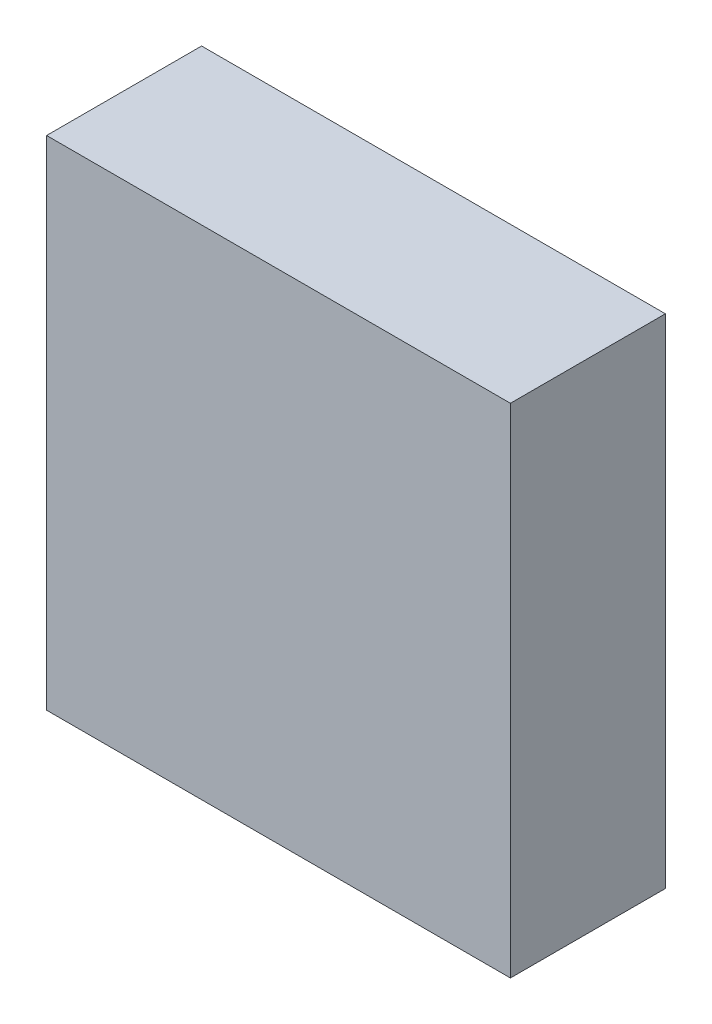
ISO-10303-21;
HEADER;
FILE_DESCRIPTION(('STEP AP214'),'2;1');
FILE_NAME('part.step','',(''),(''),'','','');
FILE_SCHEMA(('AUTOMOTIVE_DESIGN { 1 0 10303 214 1 1 1 1 }'));
ENDSEC;
DATA;
#1=APPLICATION_CONTEXT('core data for automotive mechanical design processes');
#2=APPLICATION_PROTOCOL_DEFINITION('international standard','automotive_design',2000,#1);
#3=PRODUCT_CONTEXT('',#1,'mechanical');
#4=PRODUCT('Part','Part','',(#3));
#5=PRODUCT_RELATED_PRODUCT_CATEGORY('part','',(#4));
#6=PRODUCT_DEFINITION_FORMATION('','',#4);
#7=PRODUCT_DEFINITION_CONTEXT('part definition',#1,'design');
#8=PRODUCT_DEFINITION('design','',#6,#7);
#9=PRODUCT_DEFINITION_SHAPE('','',#8);
#10=(LENGTH_UNIT() NAMED_UNIT(*) SI_UNIT(.MILLI.,.METRE.));
#11=(NAMED_UNIT(*) PLANE_ANGLE_UNIT() SI_UNIT($,.RADIAN.));
#12=(NAMED_UNIT(*) SI_UNIT($,.STERADIAN.) SOLID_ANGLE_UNIT());
#13=UNCERTAINTY_MEASURE_WITH_UNIT(LENGTH_MEASURE(1.E-05),#10,'distance_accuracy_value','');
#14=(GEOMETRIC_REPRESENTATION_CONTEXT(3) GLOBAL_UNCERTAINTY_ASSIGNED_CONTEXT((#13)) GLOBAL_UNIT_ASSIGNED_CONTEXT((#10,
#11,#12)) REPRESENTATION_CONTEXT('',''));
#15=CARTESIAN_POINT('',(0.,0.,0.));
#16=DIRECTION('',(0.,0.,1.));
#17=DIRECTION('',(1.,0.,0.));
#18=AXIS2_PLACEMENT_3D('',#15,#16,#17);
#19=CARTESIAN_POINT('',(102.5,110.,68.5));
#20=DIRECTION('',(-1.,0.,0.));
#21=DIRECTION('',(0.,-1.,0.));
#22=AXIS2_PLACEMENT_3D('',#19,#20,#21);
#23=PLANE('',#22);
#24=DIRECTION('',(0.,1.,0.));
#25=VECTOR('',#24,1.);
#26=CARTESIAN_POINT('',(102.5,110.,0.));
#27=LINE('',#26,#25);
#28=CARTESIAN_POINT('',(102.5,-110.,0.));
#29=VERTEX_POINT('',#28);
#30=CARTESIAN_POINT('',(102.5,110.,0.));
#31=VERTEX_POINT('',#30);
#32=EDGE_CURVE('E96',#29,#31,#27,.T.);
#33=ORIENTED_EDGE('',*,*,#32,.T.);
#34=DIRECTION('',(0.,0.,-1.));
#35=VECTOR('',#34,1.);
#36=CARTESIAN_POINT('',(102.5,110.,68.5));
#37=LINE('',#36,#35);
#38=CARTESIAN_POINT('',(102.5,110.,68.5));
#39=VERTEX_POINT('',#38);
#40=EDGE_CURVE('E11',#39,#31,#37,.T.);
#41=ORIENTED_EDGE('',*,*,#40,.F.);
#42=DIRECTION('',(0.,1.,0.));
#43=VECTOR('',#42,1.);
#44=CARTESIAN_POINT('',(102.5,110.,68.5));
#45=LINE('',#44,#43);
#46=CARTESIAN_POINT('',(102.5,-110.,68.5));
#47=VERTEX_POINT('',#46);
#48=EDGE_CURVE('E84',#47,#39,#45,.T.);
#49=ORIENTED_EDGE('',*,*,#48,.F.);
#50=DIRECTION('',(0.,0.,-1.));
#51=VECTOR('',#50,1.);
#52=CARTESIAN_POINT('',(102.5,-110.,68.5));
#53=LINE('',#52,#51);
#54=EDGE_CURVE('E92',#47,#29,#53,.T.);
#55=ORIENTED_EDGE('',*,*,#54,.T.);
#56=EDGE_LOOP('',(#33,#41,#49,#55));
#57=FACE_BOUND('',#56,.T.);
#58=ADVANCED_FACE('F33',(#57),#23,.F.);
#59=CARTESIAN_POINT('',(-102.5,110.,68.5));
#60=DIRECTION('',(0.,-1.,0.));
#61=DIRECTION('',(0.,0.,-1.));
#62=AXIS2_PLACEMENT_3D('',#59,#60,#61);
#63=PLANE('',#62);
#64=DIRECTION('',(-1.,0.,0.));
#65=VECTOR('',#64,1.);
#66=CARTESIAN_POINT('',(-102.5,110.,0.));
#67=LINE('',#66,#65);
#68=CARTESIAN_POINT('',(-102.5,110.,0.));
#69=VERTEX_POINT('',#68);
#70=EDGE_CURVE('E88',#31,#69,#67,.T.);
#71=ORIENTED_EDGE('',*,*,#70,.T.);
#72=DIRECTION('',(0.,0.,-1.));
#73=VECTOR('',#72,1.);
#74=CARTESIAN_POINT('',(-102.5,110.,68.5));
#75=LINE('',#74,#73);
#76=CARTESIAN_POINT('',(-102.5,110.,68.5));
#77=VERTEX_POINT('',#76);
#78=EDGE_CURVE('E41',#77,#69,#75,.T.);
#79=ORIENTED_EDGE('',*,*,#78,.F.);
#80=DIRECTION('',(-1.,0.,0.));
#81=VECTOR('',#80,1.);
#82=CARTESIAN_POINT('',(-102.5,110.,68.5));
#83=LINE('',#82,#81);
#84=EDGE_CURVE('E79',#39,#77,#83,.T.);
#85=ORIENTED_EDGE('',*,*,#84,.F.);
#86=ORIENTED_EDGE('',*,*,#40,.T.);
#87=EDGE_LOOP('',(#71,#79,#85,#86));
#88=FACE_BOUND('',#87,.T.);
#89=ADVANCED_FACE('F87',(#88),#63,.F.);
#90=CARTESIAN_POINT('',(-102.5,110.,68.5));
#91=DIRECTION('',(1.,0.,0.));
#92=DIRECTION('',(0.,1.,0.));
#93=AXIS2_PLACEMENT_3D('',#90,#91,#92);
#94=PLANE('',#93);
#95=DIRECTION('',(0.,-1.,0.));
#96=VECTOR('',#95,1.);
#97=CARTESIAN_POINT('',(-102.5,110.,0.));
#98=LINE('',#97,#96);
#99=CARTESIAN_POINT('',(-102.5,-110.,0.));
#100=VERTEX_POINT('',#99);
#101=EDGE_CURVE('E66',#69,#100,#98,.T.);
#102=ORIENTED_EDGE('',*,*,#101,.T.);
#103=DIRECTION('',(0.,0.,-1.));
#104=VECTOR('',#103,1.);
#105=CARTESIAN_POINT('',(-102.5,-110.,68.5));
#106=LINE('',#105,#104);
#107=CARTESIAN_POINT('',(-102.5,-110.,68.5));
#108=VERTEX_POINT('',#107);
#109=EDGE_CURVE('E89',#108,#100,#106,.T.);
#110=ORIENTED_EDGE('',*,*,#109,.F.);
#111=DIRECTION('',(0.,-1.,0.));
#112=VECTOR('',#111,1.);
#113=CARTESIAN_POINT('',(-102.5,110.,68.5));
#114=LINE('',#113,#112);
#115=EDGE_CURVE('E82',#77,#108,#114,.T.);
#116=ORIENTED_EDGE('',*,*,#115,.F.);
#117=ORIENTED_EDGE('',*,*,#78,.T.);
#118=EDGE_LOOP('',(#102,#110,#116,#117));
#119=FACE_BOUND('',#118,.T.);
#120=ADVANCED_FACE('F90',(#119),#94,.F.);
#121=CARTESIAN_POINT('',(-102.5,-110.,68.5));
#122=DIRECTION('',(0.,1.,0.));
#123=DIRECTION('',(-1.,0.,0.));
#124=AXIS2_PLACEMENT_3D('',#121,#122,#123);
#125=PLANE('',#124);
#126=DIRECTION('',(1.,0.,0.));
#127=VECTOR('',#126,1.);
#128=CARTESIAN_POINT('',(-102.5,-110.,0.));
#129=LINE('',#128,#127);
#130=EDGE_CURVE('E72',#100,#29,#129,.T.);
#131=ORIENTED_EDGE('',*,*,#130,.T.);
#132=ORIENTED_EDGE('',*,*,#54,.F.);
#133=DIRECTION('',(1.,0.,0.));
#134=VECTOR('',#133,1.);
#135=CARTESIAN_POINT('',(-102.5,-110.,68.5));
#136=LINE('',#135,#134);
#137=EDGE_CURVE('E49',#108,#47,#136,.T.);
#138=ORIENTED_EDGE('',*,*,#137,.F.);
#139=ORIENTED_EDGE('',*,*,#109,.T.);
#140=EDGE_LOOP('',(#131,#132,#138,#139));
#141=FACE_BOUND('',#140,.T.);
#142=ADVANCED_FACE('F103',(#141),#125,.F.);
#143=CARTESIAN_POINT('',(0.,0.,68.5));
#144=DIRECTION('',(0.,0.,1.));
#145=DIRECTION('',(1.,0.,0.));
#146=AXIS2_PLACEMENT_3D('',#143,#144,#145);
#147=PLANE('',#146);
#148=ORIENTED_EDGE('',*,*,#48,.T.);
#149=ORIENTED_EDGE('',*,*,#84,.T.);
#150=ORIENTED_EDGE('',*,*,#115,.T.);
#151=ORIENTED_EDGE('',*,*,#137,.T.);
#152=EDGE_LOOP('',(#148,#149,#150,#151));
#153=FACE_BOUND('',#152,.T.);
#154=ADVANCED_FACE('F80',(#153),#147,.T.);
#155=CARTESIAN_POINT('',(0.,0.,0.));
#156=DIRECTION('',(0.,0.,1.));
#157=DIRECTION('',(1.,0.,0.));
#158=AXIS2_PLACEMENT_3D('',#155,#156,#157);
#159=PLANE('',#158);
#160=ORIENTED_EDGE('',*,*,#32,.F.);
#161=ORIENTED_EDGE('',*,*,#130,.F.);
#162=ORIENTED_EDGE('',*,*,#101,.F.);
#163=ORIENTED_EDGE('',*,*,#70,.F.);
#164=EDGE_LOOP('',(#160,#161,#162,#163));
#165=FACE_BOUND('',#164,.T.);
#166=ADVANCED_FACE('F106',(#165),#159,.F.);
#167=CLOSED_SHELL('',(#58,#89,#120,#142,#154,#166));
#168=MANIFOLD_SOLID_BREP('B2',#167);
#169=ADVANCED_BREP_SHAPE_REPRESENTATION('',(#18,#168),#14);
#170=SHAPE_DEFINITION_REPRESENTATION(#9,#169);
ENDSEC;
END-ISO-10303-21;
